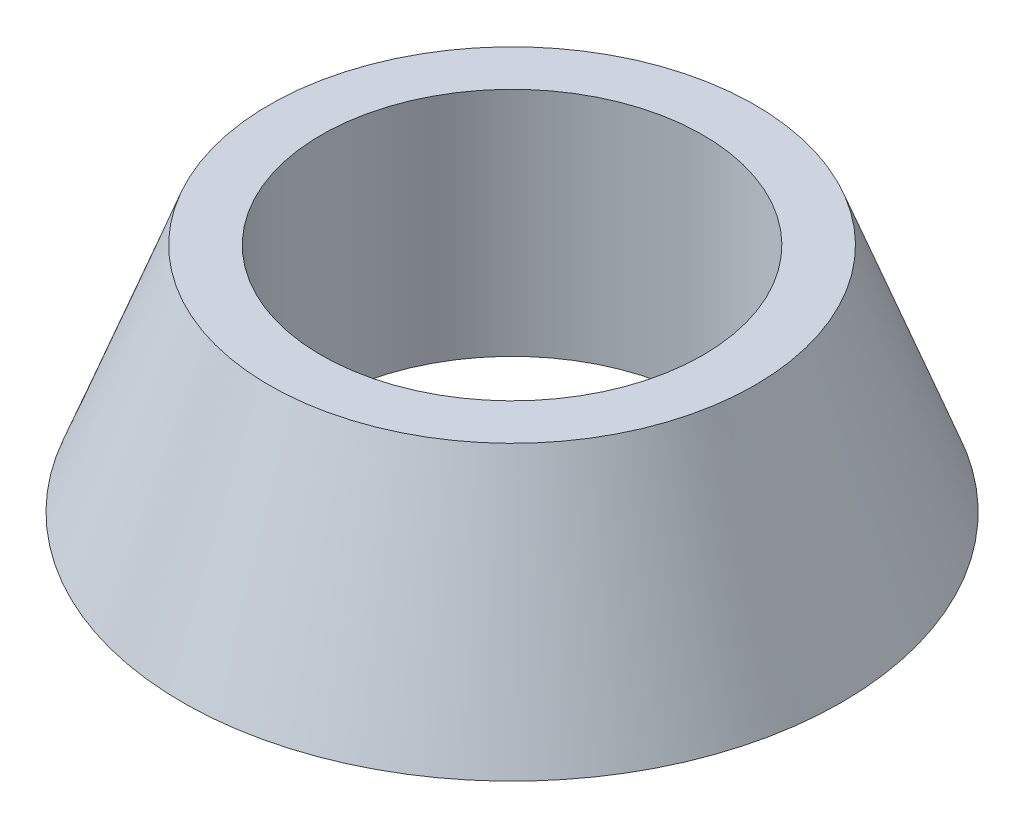
ISO-10303-21;
HEADER;
FILE_DESCRIPTION(('STEP AP214'),'2;1');
FILE_NAME('part.step','',(''),(''),'','','');
FILE_SCHEMA(('AUTOMOTIVE_DESIGN { 1 0 10303 214 1 1 1 1 }'));
ENDSEC;
DATA;
#1=APPLICATION_CONTEXT('core data for automotive mechanical design processes');
#2=APPLICATION_PROTOCOL_DEFINITION('international standard','automotive_design',2000,#1);
#3=PRODUCT_CONTEXT('',#1,'mechanical');
#4=PRODUCT('Part','Part','',(#3));
#5=PRODUCT_RELATED_PRODUCT_CATEGORY('part','',(#4));
#6=PRODUCT_DEFINITION_FORMATION('','',#4);
#7=PRODUCT_DEFINITION_CONTEXT('part definition',#1,'design');
#8=PRODUCT_DEFINITION('design','',#6,#7);
#9=PRODUCT_DEFINITION_SHAPE('','',#8);
#10=(LENGTH_UNIT() NAMED_UNIT(*) SI_UNIT(.MILLI.,.METRE.));
#11=(NAMED_UNIT(*) PLANE_ANGLE_UNIT() SI_UNIT($,.RADIAN.));
#12=(NAMED_UNIT(*) SI_UNIT($,.STERADIAN.) SOLID_ANGLE_UNIT());
#13=UNCERTAINTY_MEASURE_WITH_UNIT(LENGTH_MEASURE(1.E-05),#10,'distance_accuracy_value','');
#14=(GEOMETRIC_REPRESENTATION_CONTEXT(3) GLOBAL_UNCERTAINTY_ASSIGNED_CONTEXT((#13)) GLOBAL_UNIT_ASSIGNED_CONTEXT((#10,
#11,#12)) REPRESENTATION_CONTEXT('',''));
#15=CARTESIAN_POINT('',(0.,0.,0.));
#16=DIRECTION('',(0.,0.,1.));
#17=DIRECTION('',(1.,0.,0.));
#18=AXIS2_PLACEMENT_3D('',#15,#16,#17);
#19=CARTESIAN_POINT('',(0.,0.,0.));
#20=DIRECTION('',(0.,-1.,0.));
#21=DIRECTION('',(1.,0.,0.));
#22=AXIS2_PLACEMENT_3D('',#19,#20,#21);
#23=CYLINDRICAL_SURFACE('',#22,1.65);
#24=CARTESIAN_POINT('',(0.,2.,0.));
#25=DIRECTION('',(0.,-1.,0.));
#26=DIRECTION('',(1.,0.,0.));
#27=AXIS2_PLACEMENT_3D('',#24,#25,#26);
#28=CIRCLE('',#27,1.65);
#29=CARTESIAN_POINT('',(1.65,2.,0.));
#30=VERTEX_POINT('',#29);
#31=EDGE_CURVE('E10',#30,#30,#28,.T.);
#32=ORIENTED_EDGE('',*,*,#31,.F.);
#33=EDGE_LOOP('',(#32));
#34=FACE_BOUND('',#33,.T.);
#35=CARTESIAN_POINT('',(0.,0.,0.));
#36=DIRECTION('',(0.,-1.,0.));
#37=DIRECTION('',(1.,0.,0.));
#38=AXIS2_PLACEMENT_3D('',#35,#36,#37);
#39=CIRCLE('',#38,1.65);
#40=CARTESIAN_POINT('',(1.65,0.,0.));
#41=VERTEX_POINT('',#40);
#42=EDGE_CURVE('E44',#41,#41,#39,.T.);
#43=ORIENTED_EDGE('',*,*,#42,.T.);
#44=EDGE_LOOP('',(#43));
#45=FACE_BOUND('',#44,.T.);
#46=ADVANCED_FACE('F30',(#34,#45),#23,.F.);
#47=CARTESIAN_POINT('',(-1.65,2.,0.));
#48=DIRECTION('',(0.,-1.,0.));
#49=DIRECTION('',(1.,0.,0.));
#50=AXIS2_PLACEMENT_3D('',#47,#48,#49);
#51=PLANE('',#50);
#52=CARTESIAN_POINT('',(0.,2.,0.));
#53=DIRECTION('',(0.,-1.,0.));
#54=DIRECTION('',(1.,0.,0.));
#55=AXIS2_PLACEMENT_3D('',#52,#53,#54);
#56=CIRCLE('',#55,2.1);
#57=CARTESIAN_POINT('',(2.1,2.,0.));
#58=VERTEX_POINT('',#57);
#59=EDGE_CURVE('E36',#58,#58,#56,.T.);
#60=ORIENTED_EDGE('',*,*,#59,.F.);
#61=EDGE_LOOP('',(#60));
#62=FACE_BOUND('',#61,.T.);
#63=ORIENTED_EDGE('',*,*,#31,.T.);
#64=EDGE_LOOP('',(#63));
#65=FACE_BOUND('',#64,.T.);
#66=ADVANCED_FACE('F59',(#62,#65),#51,.F.);
#67=CARTESIAN_POINT('',(0.,2.,0.));
#68=DIRECTION('',(0.,-1.,0.));
#69=DIRECTION('',(1.,0.,0.));
#70=AXIS2_PLACEMENT_3D('',#67,#68,#69);
#71=CONICAL_SURFACE('',#70,2.1,0.358770670270572);
#72=CARTESIAN_POINT('',(0.,0.,0.));
#73=DIRECTION('',(0.,-1.,0.));
#74=DIRECTION('',(1.,0.,0.));
#75=AXIS2_PLACEMENT_3D('',#72,#73,#74);
#76=CIRCLE('',#75,2.85);
#77=CARTESIAN_POINT('',(2.85,0.,0.));
#78=VERTEX_POINT('',#77);
#79=EDGE_CURVE('E40',#78,#78,#76,.T.);
#80=ORIENTED_EDGE('',*,*,#79,.F.);
#81=EDGE_LOOP('',(#80));
#82=FACE_BOUND('',#81,.T.);
#83=ORIENTED_EDGE('',*,*,#59,.T.);
#84=EDGE_LOOP('',(#83));
#85=FACE_BOUND('',#84,.T.);
#86=ADVANCED_FACE('F54',(#82,#85),#71,.T.);
#87=CARTESIAN_POINT('',(-2.85,0.,0.));
#88=DIRECTION('',(0.,1.,0.));
#89=DIRECTION('',(-1.,0.,0.));
#90=AXIS2_PLACEMENT_3D('',#87,#88,#89);
#91=PLANE('',#90);
#92=ORIENTED_EDGE('',*,*,#42,.F.);
#93=EDGE_LOOP('',(#92));
#94=FACE_BOUND('',#93,.T.);
#95=ORIENTED_EDGE('',*,*,#79,.T.);
#96=EDGE_LOOP('',(#95));
#97=FACE_BOUND('',#96,.T.);
#98=ADVANCED_FACE('F51',(#94,#97),#91,.F.);
#99=CLOSED_SHELL('',(#46,#66,#86,#98));
#100=MANIFOLD_SOLID_BREP('B2',#99);
#101=ADVANCED_BREP_SHAPE_REPRESENTATION('',(#18,#100),#14);
#102=SHAPE_DEFINITION_REPRESENTATION(#9,#101);
ENDSEC;
END-ISO-10303-21;
